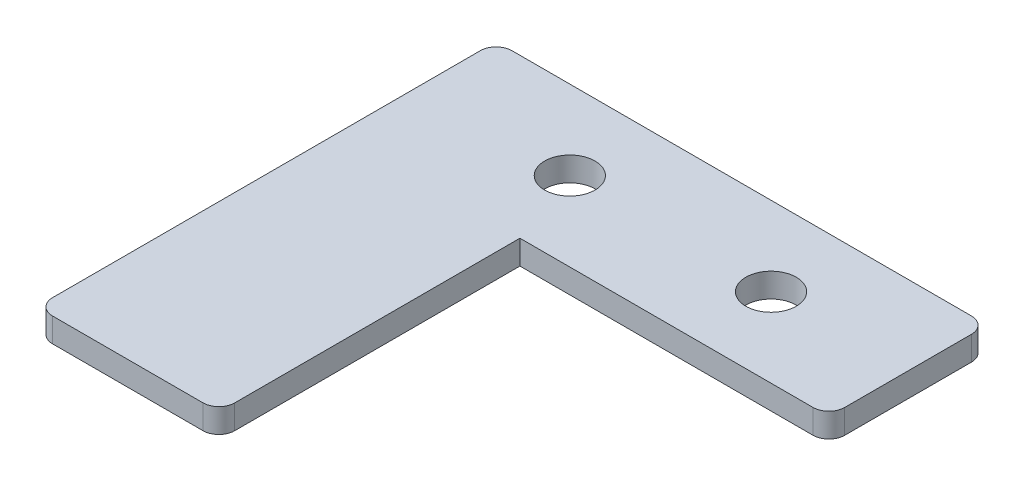
ISO-10303-21;
HEADER;
FILE_DESCRIPTION(('STEP AP214'),'2;1');
FILE_NAME('part.step','',(''),(''),'','','');
FILE_SCHEMA(('AUTOMOTIVE_DESIGN { 1 0 10303 214 1 1 1 1 }'));
ENDSEC;
DATA;
#1=APPLICATION_CONTEXT('core data for automotive mechanical design processes');
#2=APPLICATION_PROTOCOL_DEFINITION('international standard','automotive_design',2000,#1);
#3=PRODUCT_CONTEXT('',#1,'mechanical');
#4=PRODUCT('Part','Part','',(#3));
#5=PRODUCT_RELATED_PRODUCT_CATEGORY('part','',(#4));
#6=PRODUCT_DEFINITION_FORMATION('','',#4);
#7=PRODUCT_DEFINITION_CONTEXT('part definition',#1,'design');
#8=PRODUCT_DEFINITION('design','',#6,#7);
#9=PRODUCT_DEFINITION_SHAPE('','',#8);
#10=(LENGTH_UNIT() NAMED_UNIT(*) SI_UNIT(.MILLI.,.METRE.));
#11=(NAMED_UNIT(*) PLANE_ANGLE_UNIT() SI_UNIT($,.RADIAN.));
#12=(NAMED_UNIT(*) SI_UNIT($,.STERADIAN.) SOLID_ANGLE_UNIT());
#13=UNCERTAINTY_MEASURE_WITH_UNIT(LENGTH_MEASURE(1.E-05),#10,'distance_accuracy_value','');
#14=(GEOMETRIC_REPRESENTATION_CONTEXT(3) GLOBAL_UNCERTAINTY_ASSIGNED_CONTEXT((#13)) GLOBAL_UNIT_ASSIGNED_CONTEXT((#10,
#11,#12)) REPRESENTATION_CONTEXT('',''));
#15=CARTESIAN_POINT('',(0.,0.,0.));
#16=DIRECTION('',(0.,0.,1.));
#17=DIRECTION('',(1.,0.,0.));
#18=AXIS2_PLACEMENT_3D('',#15,#16,#17);
#19=CARTESIAN_POINT('',(-9.65,1.524,0.));
#20=DIRECTION('',(1.,0.,0.));
#21=DIRECTION('',(0.,0.,-1.));
#22=AXIS2_PLACEMENT_3D('',#19,#20,#21);
#23=PLANE('',#22);
#24=DIRECTION('',(0.,0.,1.));
#25=VECTOR('',#24,1.);
#26=CARTESIAN_POINT('',(-9.65,1.524,0.));
#27=LINE('',#26,#25);
#28=CARTESIAN_POINT('',(-9.65,1.524,-4.));
#29=VERTEX_POINT('',#28);
#30=CARTESIAN_POINT('',(-9.65,1.524,23.));
#31=VERTEX_POINT('',#30);
#32=EDGE_CURVE('E163',#29,#31,#27,.T.);
#33=ORIENTED_EDGE('',*,*,#32,.F.);
#34=DIRECTION('',(0.,-1.,0.));
#35=VECTOR('',#34,1.);
#36=CARTESIAN_POINT('',(-9.65,0.,-4.));
#37=LINE('',#36,#35);
#38=CARTESIAN_POINT('',(-9.65,0.,-4.));
#39=VERTEX_POINT('',#38);
#40=EDGE_CURVE('E211',#29,#39,#37,.T.);
#41=ORIENTED_EDGE('',*,*,#40,.T.);
#42=DIRECTION('',(0.,0.,1.));
#43=VECTOR('',#42,1.);
#44=CARTESIAN_POINT('',(-9.65,0.,0.));
#45=LINE('',#44,#43);
#46=CARTESIAN_POINT('',(-9.65,0.,23.));
#47=VERTEX_POINT('',#46);
#48=EDGE_CURVE('E180',#39,#47,#45,.T.);
#49=ORIENTED_EDGE('',*,*,#48,.T.);
#50=DIRECTION('',(0.,-1.,0.));
#51=VECTOR('',#50,1.);
#52=CARTESIAN_POINT('',(-9.65,1.524,23.));
#53=LINE('',#52,#51);
#54=EDGE_CURVE('E143',#47,#31,#53,.F.);
#55=ORIENTED_EDGE('',*,*,#54,.T.);
#56=EDGE_LOOP('',(#33,#41,#49,#55));
#57=FACE_BOUND('',#56,.T.);
#58=ADVANCED_FACE('F45',(#57),#23,.F.);
#59=CARTESIAN_POINT('',(0.,1.524,24.));
#60=DIRECTION('',(0.,0.,-1.));
#61=DIRECTION('',(-1.,0.,0.));
#62=AXIS2_PLACEMENT_3D('',#59,#60,#61);
#63=PLANE('',#62);
#64=DIRECTION('',(1.,0.,0.));
#65=VECTOR('',#64,1.);
#66=CARTESIAN_POINT('',(0.,0.,24.));
#67=LINE('',#66,#65);
#68=CARTESIAN_POINT('',(-8.65,0.,24.));
#69=VERTEX_POINT('',#68);
#70=CARTESIAN_POINT('',(0.850000000000002,0.,24.));
#71=VERTEX_POINT('',#70);
#72=EDGE_CURVE('E184',#69,#71,#67,.T.);
#73=ORIENTED_EDGE('',*,*,#72,.T.);
#74=DIRECTION('',(0.,-1.,0.));
#75=VECTOR('',#74,1.);
#76=CARTESIAN_POINT('',(0.850000000000002,1.524,24.));
#77=LINE('',#76,#75);
#78=CARTESIAN_POINT('',(0.850000000000002,1.524,24.));
#79=VERTEX_POINT('',#78);
#80=EDGE_CURVE('E11',#71,#79,#77,.F.);
#81=ORIENTED_EDGE('',*,*,#80,.T.);
#82=DIRECTION('',(1.,0.,0.));
#83=VECTOR('',#82,1.);
#84=CARTESIAN_POINT('',(0.,1.524,24.));
#85=LINE('',#84,#83);
#86=CARTESIAN_POINT('',(-8.65,1.524,24.));
#87=VERTEX_POINT('',#86);
#88=EDGE_CURVE('E160',#87,#79,#85,.T.);
#89=ORIENTED_EDGE('',*,*,#88,.F.);
#90=DIRECTION('',(0.,-1.,0.));
#91=VECTOR('',#90,1.);
#92=CARTESIAN_POINT('',(-8.65,1.524,24.));
#93=LINE('',#92,#91);
#94=EDGE_CURVE('E54',#87,#69,#93,.T.);
#95=ORIENTED_EDGE('',*,*,#94,.T.);
#96=EDGE_LOOP('',(#73,#81,#89,#95));
#97=FACE_BOUND('',#96,.T.);
#98=ADVANCED_FACE('F266',(#97),#63,.F.);
#99=CARTESIAN_POINT('',(1.85,1.524,0.));
#100=DIRECTION('',(1.,0.,0.));
#101=DIRECTION('',(0.,0.,-1.));
#102=AXIS2_PLACEMENT_3D('',#99,#100,#101);
#103=PLANE('',#102);
#104=DIRECTION('',(0.,0.,1.));
#105=VECTOR('',#104,1.);
#106=CARTESIAN_POINT('',(1.85,1.524,0.));
#107=LINE('',#106,#105);
#108=CARTESIAN_POINT('',(1.85,1.524,5.));
#109=VERTEX_POINT('',#108);
#110=CARTESIAN_POINT('',(1.85,1.524,23.));
#111=VERTEX_POINT('',#110);
#112=EDGE_CURVE('E135',#109,#111,#107,.T.);
#113=ORIENTED_EDGE('',*,*,#112,.T.);
#114=DIRECTION('',(0.,-1.,0.));
#115=VECTOR('',#114,1.);
#116=CARTESIAN_POINT('',(1.85,0.,23.));
#117=LINE('',#116,#115);
#118=CARTESIAN_POINT('',(1.85,0.,23.));
#119=VERTEX_POINT('',#118);
#120=EDGE_CURVE('E258',#111,#119,#117,.T.);
#121=ORIENTED_EDGE('',*,*,#120,.T.);
#122=DIRECTION('',(0.,0.,1.));
#123=VECTOR('',#122,1.);
#124=CARTESIAN_POINT('',(1.85,0.,0.));
#125=LINE('',#124,#123);
#126=CARTESIAN_POINT('',(1.85,0.,5.));
#127=VERTEX_POINT('',#126);
#128=EDGE_CURVE('E138',#127,#119,#125,.T.);
#129=ORIENTED_EDGE('',*,*,#128,.F.);
#130=DIRECTION('',(0.,-1.,0.));
#131=VECTOR('',#130,1.);
#132=CARTESIAN_POINT('',(1.85,1.524,5.));
#133=LINE('',#132,#131);
#134=EDGE_CURVE('E130',#109,#127,#133,.T.);
#135=ORIENTED_EDGE('',*,*,#134,.F.);
#136=EDGE_LOOP('',(#113,#121,#129,#135));
#137=FACE_BOUND('',#136,.T.);
#138=ADVANCED_FACE('F132',(#137),#103,.T.);
#139=CARTESIAN_POINT('',(0.,1.524,5.));
#140=DIRECTION('',(0.,0.,-1.));
#141=DIRECTION('',(-1.,0.,0.));
#142=AXIS2_PLACEMENT_3D('',#139,#140,#141);
#143=PLANE('',#142);
#144=DIRECTION('',(1.,0.,0.));
#145=VECTOR('',#144,1.);
#146=CARTESIAN_POINT('',(0.,0.,5.));
#147=LINE('',#146,#145);
#148=CARTESIAN_POINT('',(20.35,0.,5.));
#149=VERTEX_POINT('',#148);
#150=EDGE_CURVE('E190',#127,#149,#147,.T.);
#151=ORIENTED_EDGE('',*,*,#150,.T.);
#152=DIRECTION('',(0.,-1.,0.));
#153=VECTOR('',#152,1.);
#154=CARTESIAN_POINT('',(20.35,1.524,5.));
#155=LINE('',#154,#153);
#156=CARTESIAN_POINT('',(20.35,1.524,5.));
#157=VERTEX_POINT('',#156);
#158=EDGE_CURVE('E149',#149,#157,#155,.F.);
#159=ORIENTED_EDGE('',*,*,#158,.T.);
#160=DIRECTION('',(1.,0.,0.));
#161=VECTOR('',#160,1.);
#162=CARTESIAN_POINT('',(0.,1.524,5.));
#163=LINE('',#162,#161);
#164=EDGE_CURVE('E146',#109,#157,#163,.T.);
#165=ORIENTED_EDGE('',*,*,#164,.F.);
#166=ORIENTED_EDGE('',*,*,#134,.T.);
#167=EDGE_LOOP('',(#151,#159,#165,#166));
#168=FACE_BOUND('',#167,.T.);
#169=ADVANCED_FACE('F147',(#168),#143,.F.);
#170=CARTESIAN_POINT('',(21.35,1.524,0.));
#171=DIRECTION('',(1.,0.,0.));
#172=DIRECTION('',(0.,0.,-1.));
#173=AXIS2_PLACEMENT_3D('',#170,#171,#172);
#174=PLANE('',#173);
#175=DIRECTION('',(0.,0.,1.));
#176=VECTOR('',#175,1.);
#177=CARTESIAN_POINT('',(21.35,0.,0.));
#178=LINE('',#177,#176);
#179=CARTESIAN_POINT('',(21.35,0.,-4.));
#180=VERTEX_POINT('',#179);
#181=CARTESIAN_POINT('',(21.35,0.,4.));
#182=VERTEX_POINT('',#181);
#183=EDGE_CURVE('E193',#180,#182,#178,.T.);
#184=ORIENTED_EDGE('',*,*,#183,.F.);
#185=DIRECTION('',(0.,-1.,0.));
#186=VECTOR('',#185,1.);
#187=CARTESIAN_POINT('',(21.35,1.524,-4.));
#188=LINE('',#187,#186);
#189=CARTESIAN_POINT('',(21.35,1.524,-4.));
#190=VERTEX_POINT('',#189);
#191=EDGE_CURVE('E68',#180,#190,#188,.F.);
#192=ORIENTED_EDGE('',*,*,#191,.T.);
#193=DIRECTION('',(0.,0.,1.));
#194=VECTOR('',#193,1.);
#195=CARTESIAN_POINT('',(21.35,1.524,0.));
#196=LINE('',#195,#194);
#197=CARTESIAN_POINT('',(21.35,1.524,4.));
#198=VERTEX_POINT('',#197);
#199=EDGE_CURVE('E151',#190,#198,#196,.T.);
#200=ORIENTED_EDGE('',*,*,#199,.T.);
#201=DIRECTION('',(0.,-1.,0.));
#202=VECTOR('',#201,1.);
#203=CARTESIAN_POINT('',(21.35,0.,4.));
#204=LINE('',#203,#202);
#205=EDGE_CURVE('E250',#198,#182,#204,.T.);
#206=ORIENTED_EDGE('',*,*,#205,.T.);
#207=EDGE_LOOP('',(#184,#192,#200,#206));
#208=FACE_BOUND('',#207,.T.);
#209=ADVANCED_FACE('F292',(#208),#174,.T.);
#210=CARTESIAN_POINT('',(12.7,1.524,0.));
#211=DIRECTION('',(0.,-1.,0.));
#212=DIRECTION('',(0.,0.,-1.));
#213=AXIS2_PLACEMENT_3D('',#210,#211,#212);
#214=CYLINDRICAL_SURFACE('',#213,1.59);
#215=CARTESIAN_POINT('',(12.7,1.524,0.));
#216=DIRECTION('',(0.,1.,0.));
#217=DIRECTION('',(0.,0.,1.));
#218=AXIS2_PLACEMENT_3D('',#215,#216,#217);
#219=CIRCLE('',#218,1.59);
#220=CARTESIAN_POINT('',(12.7,1.524,-1.59));
#221=VERTEX_POINT('',#220);
#222=EDGE_CURVE('E173',#221,#221,#219,.T.);
#223=CARTESIAN_POINT('',(12.7,0.,0.));
#224=DIRECTION('',(0.,1.,0.));
#225=DIRECTION('',(0.,0.,1.));
#226=AXIS2_PLACEMENT_3D('',#223,#224,#225);
#227=CIRCLE('',#226,1.59);
#228=CARTESIAN_POINT('',(12.7,0.,-1.59));
#229=VERTEX_POINT('',#228);
#230=EDGE_CURVE('E201',#229,#229,#227,.T.);
#231=CARTESIAN_POINT('',(12.7,1.524,-1.59));
#232=CARTESIAN_POINT('',(12.7,1.508125,-1.59));
#233=CARTESIAN_POINT('',(12.7,1.49225,-1.59));
#234=CARTESIAN_POINT('',(12.7,1.4605,-1.59));
#235=CARTESIAN_POINT('',(12.7,1.444625,-1.59));
#236=CARTESIAN_POINT('',(12.7,1.412875,-1.59));
#237=CARTESIAN_POINT('',(12.7,1.397,-1.59));
#238=CARTESIAN_POINT('',(12.7,1.36525,-1.59));
#239=CARTESIAN_POINT('',(12.7,1.349375,-1.59));
#240=CARTESIAN_POINT('',(12.7,1.317625,-1.59));
#241=CARTESIAN_POINT('',(12.7,1.30175,-1.59));
#242=CARTESIAN_POINT('',(12.7,1.27,-1.59));
#243=CARTESIAN_POINT('',(12.7,1.254125,-1.59));
#244=CARTESIAN_POINT('',(12.7,1.222375,-1.59));
#245=CARTESIAN_POINT('',(12.7,1.2065,-1.59));
#246=CARTESIAN_POINT('',(12.7,1.17475,-1.59));
#247=CARTESIAN_POINT('',(12.7,1.158875,-1.59));
#248=CARTESIAN_POINT('',(12.7,1.127125,-1.59));
#249=CARTESIAN_POINT('',(12.7,1.11125,-1.59));
#250=CARTESIAN_POINT('',(12.7,1.0795,-1.59));
#251=CARTESIAN_POINT('',(12.7,1.063625,-1.59));
#252=CARTESIAN_POINT('',(12.7,1.031875,-1.59));
#253=CARTESIAN_POINT('',(12.7,1.016,-1.59));
#254=CARTESIAN_POINT('',(12.7,0.98425,-1.59));
#255=CARTESIAN_POINT('',(12.7,0.968375,-1.59));
#256=CARTESIAN_POINT('',(12.7,0.936625,-1.59));
#257=CARTESIAN_POINT('',(12.7,0.92075,-1.59));
#258=CARTESIAN_POINT('',(12.7,0.889,-1.59));
#259=CARTESIAN_POINT('',(12.7,0.873125,-1.59));
#260=CARTESIAN_POINT('',(12.7,0.841375,-1.59));
#261=CARTESIAN_POINT('',(12.7,0.8255,-1.59));
#262=CARTESIAN_POINT('',(12.7,0.79375,-1.59));
#263=CARTESIAN_POINT('',(12.7,0.777875,-1.59));
#264=CARTESIAN_POINT('',(12.7,0.746125,-1.59));
#265=CARTESIAN_POINT('',(12.7,0.73025,-1.59));
#266=CARTESIAN_POINT('',(12.7,0.6985,-1.59));
#267=CARTESIAN_POINT('',(12.7,0.682625,-1.59));
#268=CARTESIAN_POINT('',(12.7,0.650875,-1.59));
#269=CARTESIAN_POINT('',(12.7,0.635,-1.59));
#270=CARTESIAN_POINT('',(12.7,0.60325,-1.59));
#271=CARTESIAN_POINT('',(12.7,0.587375,-1.59));
#272=CARTESIAN_POINT('',(12.7,0.555625,-1.59));
#273=CARTESIAN_POINT('',(12.7,0.53975,-1.59));
#274=CARTESIAN_POINT('',(12.7,0.508,-1.59));
#275=CARTESIAN_POINT('',(12.7,0.492125,-1.59));
#276=CARTESIAN_POINT('',(12.7,0.460375,-1.59));
#277=CARTESIAN_POINT('',(12.7,0.4445,-1.59));
#278=CARTESIAN_POINT('',(12.7,0.41275,-1.59));
#279=CARTESIAN_POINT('',(12.7,0.396875,-1.59));
#280=CARTESIAN_POINT('',(12.7,0.365125,-1.59));
#281=CARTESIAN_POINT('',(12.7,0.34925,-1.59));
#282=CARTESIAN_POINT('',(12.7,0.3175,-1.59));
#283=CARTESIAN_POINT('',(12.7,0.301625,-1.59));
#284=CARTESIAN_POINT('',(12.7,0.269875,-1.59));
#285=CARTESIAN_POINT('',(12.7,0.254,-1.59));
#286=CARTESIAN_POINT('',(12.7,0.22225,-1.59));
#287=CARTESIAN_POINT('',(12.7,0.206375,-1.59));
#288=CARTESIAN_POINT('',(12.7,0.174625,-1.59));
#289=CARTESIAN_POINT('',(12.7,0.15875,-1.59));
#290=CARTESIAN_POINT('',(12.7,0.127,-1.59));
#291=CARTESIAN_POINT('',(12.7,0.111125,-1.59));
#292=CARTESIAN_POINT('',(12.7,0.079375,-1.59));
#293=CARTESIAN_POINT('',(12.7,0.0635,-1.59));
#294=CARTESIAN_POINT('',(12.7,0.0317499999999999,-1.59));
#295=CARTESIAN_POINT('',(12.7,0.015875,-1.59));
#296=CARTESIAN_POINT('',(12.7,0.,-1.59));
#297=B_SPLINE_CURVE_WITH_KNOTS('',3,(#231,#232,#233,#234,#235,#236,#237,#238,#239,#240,#241,
#242,#243,#244,#245,#246,#247,#248,#249,#250,#251,#252,#253,#254,#255,#256,#257,#258,#259,#260,
#261,#262,#263,#264,#265,#266,#267,#268,#269,#270,#271,#272,#273,#274,#275,#276,#277,#278,#279,
#280,#281,#282,#283,#284,#285,#286,#287,#288,#289,#290,#291,#292,#293,#294,#295,#296),
.UNSPECIFIED.,.F.,.F.,(4,2,2,2,2,2,2,2,2,2,2,2,2,2,2,2,2,2,2,2,2,2,2,2,2,2,2,2,2,2,2,2,4),(0.,
0.0476250000000001,0.0952500000000001,0.142875,0.1905,0.238125,0.28575,0.333375,0.381,0.428625,
0.47625,0.523875,0.5715,0.619125,0.66675,0.714375,0.762,0.809625,0.85725,0.904875,0.9525,
1.000125,1.04775,1.095375,1.143,1.190625,1.23825,1.285875,1.3335,1.381125,1.42875,1.476375,
1.524),.UNSPECIFIED.);
#298=EDGE_CURVE('BSEAM325',#221,#229,#297,.T.);
#299=ORIENTED_EDGE('',*,*,#222,.T.);
#300=ORIENTED_EDGE('',*,*,#230,.F.);
#301=ORIENTED_EDGE('',*,*,#298,.T.);
#302=ORIENTED_EDGE('',*,*,#298,.F.);
#303=EDGE_LOOP('',(#299,#301,#300,#302));
#304=FACE_BOUND('',#303,.T.);
#305=ADVANCED_FACE('F325',(#304),#214,.F.);
#306=CARTESIAN_POINT('',(0.,1.524,-5.));
#307=DIRECTION('',(0.,0.,-1.));
#308=DIRECTION('',(-1.,0.,0.));
#309=AXIS2_PLACEMENT_3D('',#306,#307,#308);
#310=PLANE('',#309);
#311=DIRECTION('',(1.,0.,0.));
#312=VECTOR('',#311,1.);
#313=CARTESIAN_POINT('',(0.,0.,-5.));
#314=LINE('',#313,#312);
#315=CARTESIAN_POINT('',(-8.65,0.,-5.));
#316=VERTEX_POINT('',#315);
#317=CARTESIAN_POINT('',(20.35,0.,-5.));
#318=VERTEX_POINT('',#317);
#319=EDGE_CURVE('E197',#316,#318,#314,.T.);
#320=ORIENTED_EDGE('',*,*,#319,.F.);
#321=DIRECTION('',(0.,-1.,0.));
#322=VECTOR('',#321,1.);
#323=CARTESIAN_POINT('',(-8.65,1.524,-5.));
#324=LINE('',#323,#322);
#325=CARTESIAN_POINT('',(-8.65,1.524,-5.));
#326=VERTEX_POINT('',#325);
#327=EDGE_CURVE('E234',#316,#326,#324,.F.);
#328=ORIENTED_EDGE('',*,*,#327,.T.);
#329=DIRECTION('',(1.,0.,0.));
#330=VECTOR('',#329,1.);
#331=CARTESIAN_POINT('',(0.,1.524,-5.));
#332=LINE('',#331,#330);
#333=CARTESIAN_POINT('',(20.35,1.524,-5.));
#334=VERTEX_POINT('',#333);
#335=EDGE_CURVE('E169',#326,#334,#332,.T.);
#336=ORIENTED_EDGE('',*,*,#335,.T.);
#337=DIRECTION('',(0.,-1.,0.));
#338=VECTOR('',#337,1.);
#339=CARTESIAN_POINT('',(20.35,1.524,-5.));
#340=LINE('',#339,#338);
#341=EDGE_CURVE('E230',#334,#318,#340,.T.);
#342=ORIENTED_EDGE('',*,*,#341,.T.);
#343=EDGE_LOOP('',(#320,#328,#336,#342));
#344=FACE_BOUND('',#343,.T.);
#345=ADVANCED_FACE('F285',(#344),#310,.T.);
#346=CARTESIAN_POINT('',(0.,1.524,0.));
#347=DIRECTION('',(0.,-1.,0.));
#348=DIRECTION('',(0.,0.,-1.));
#349=AXIS2_PLACEMENT_3D('',#346,#347,#348);
#350=CYLINDRICAL_SURFACE('',#349,1.59);
#351=CARTESIAN_POINT('',(0.,1.524,0.));
#352=DIRECTION('',(0.,1.,0.));
#353=DIRECTION('',(0.,0.,1.));
#354=AXIS2_PLACEMENT_3D('',#351,#352,#353);
#355=CIRCLE('',#354,1.59);
#356=CARTESIAN_POINT('',(0.,1.524,-1.59));
#357=VERTEX_POINT('',#356);
#358=EDGE_CURVE('E144',#357,#357,#355,.T.);
#359=CARTESIAN_POINT('',(0.,0.,0.));
#360=DIRECTION('',(0.,1.,0.));
#361=DIRECTION('',(0.,0.,1.));
#362=AXIS2_PLACEMENT_3D('',#359,#360,#361);
#363=CIRCLE('',#362,1.59);
#364=CARTESIAN_POINT('',(0.,0.,-1.59));
#365=VERTEX_POINT('',#364);
#366=EDGE_CURVE('E205',#365,#365,#363,.T.);
#367=CARTESIAN_POINT('',(0.,1.524,-1.59));
#368=CARTESIAN_POINT('',(0.,1.508125,-1.59));
#369=CARTESIAN_POINT('',(0.,1.49225,-1.59));
#370=CARTESIAN_POINT('',(0.,1.4605,-1.59));
#371=CARTESIAN_POINT('',(0.,1.444625,-1.59));
#372=CARTESIAN_POINT('',(0.,1.412875,-1.59));
#373=CARTESIAN_POINT('',(0.,1.397,-1.59));
#374=CARTESIAN_POINT('',(0.,1.36525,-1.59));
#375=CARTESIAN_POINT('',(0.,1.349375,-1.59));
#376=CARTESIAN_POINT('',(0.,1.317625,-1.59));
#377=CARTESIAN_POINT('',(0.,1.30175,-1.59));
#378=CARTESIAN_POINT('',(0.,1.27,-1.59));
#379=CARTESIAN_POINT('',(0.,1.254125,-1.59));
#380=CARTESIAN_POINT('',(0.,1.222375,-1.59));
#381=CARTESIAN_POINT('',(0.,1.2065,-1.59));
#382=CARTESIAN_POINT('',(0.,1.17475,-1.59));
#383=CARTESIAN_POINT('',(0.,1.158875,-1.59));
#384=CARTESIAN_POINT('',(0.,1.127125,-1.59));
#385=CARTESIAN_POINT('',(0.,1.11125,-1.59));
#386=CARTESIAN_POINT('',(0.,1.0795,-1.59));
#387=CARTESIAN_POINT('',(0.,1.063625,-1.59));
#388=CARTESIAN_POINT('',(0.,1.031875,-1.59));
#389=CARTESIAN_POINT('',(0.,1.016,-1.59));
#390=CARTESIAN_POINT('',(0.,0.98425,-1.59));
#391=CARTESIAN_POINT('',(0.,0.968375,-1.59));
#392=CARTESIAN_POINT('',(0.,0.936625,-1.59));
#393=CARTESIAN_POINT('',(0.,0.92075,-1.59));
#394=CARTESIAN_POINT('',(0.,0.889,-1.59));
#395=CARTESIAN_POINT('',(0.,0.873125,-1.59));
#396=CARTESIAN_POINT('',(0.,0.841375,-1.59));
#397=CARTESIAN_POINT('',(0.,0.8255,-1.59));
#398=CARTESIAN_POINT('',(0.,0.79375,-1.59));
#399=CARTESIAN_POINT('',(0.,0.777875,-1.59));
#400=CARTESIAN_POINT('',(0.,0.746125,-1.59));
#401=CARTESIAN_POINT('',(0.,0.73025,-1.59));
#402=CARTESIAN_POINT('',(0.,0.6985,-1.59));
#403=CARTESIAN_POINT('',(0.,0.682625,-1.59));
#404=CARTESIAN_POINT('',(0.,0.650875,-1.59));
#405=CARTESIAN_POINT('',(0.,0.635,-1.59));
#406=CARTESIAN_POINT('',(0.,0.60325,-1.59));
#407=CARTESIAN_POINT('',(0.,0.587375,-1.59));
#408=CARTESIAN_POINT('',(0.,0.555625,-1.59));
#409=CARTESIAN_POINT('',(0.,0.53975,-1.59));
#410=CARTESIAN_POINT('',(0.,0.508,-1.59));
#411=CARTESIAN_POINT('',(0.,0.492125,-1.59));
#412=CARTESIAN_POINT('',(0.,0.460375,-1.59));
#413=CARTESIAN_POINT('',(0.,0.4445,-1.59));
#414=CARTESIAN_POINT('',(0.,0.41275,-1.59));
#415=CARTESIAN_POINT('',(0.,0.396875,-1.59));
#416=CARTESIAN_POINT('',(0.,0.365125,-1.59));
#417=CARTESIAN_POINT('',(0.,0.34925,-1.59));
#418=CARTESIAN_POINT('',(0.,0.3175,-1.59));
#419=CARTESIAN_POINT('',(0.,0.301625,-1.59));
#420=CARTESIAN_POINT('',(0.,0.269875,-1.59));
#421=CARTESIAN_POINT('',(0.,0.254,-1.59));
#422=CARTESIAN_POINT('',(0.,0.22225,-1.59));
#423=CARTESIAN_POINT('',(0.,0.206375,-1.59));
#424=CARTESIAN_POINT('',(0.,0.174625,-1.59));
#425=CARTESIAN_POINT('',(0.,0.15875,-1.59));
#426=CARTESIAN_POINT('',(0.,0.127,-1.59));
#427=CARTESIAN_POINT('',(0.,0.111125,-1.59));
#428=CARTESIAN_POINT('',(0.,0.079375,-1.59));
#429=CARTESIAN_POINT('',(0.,0.0635,-1.59));
#430=CARTESIAN_POINT('',(0.,0.0317499999999999,-1.59));
#431=CARTESIAN_POINT('',(0.,0.015875,-1.59));
#432=CARTESIAN_POINT('',(0.,0.,-1.59));
#433=B_SPLINE_CURVE_WITH_KNOTS('',3,(#367,#368,#369,#370,#371,#372,#373,#374,#375,#376,#377,
#378,#379,#380,#381,#382,#383,#384,#385,#386,#387,#388,#389,#390,#391,#392,#393,#394,#395,#396,
#397,#398,#399,#400,#401,#402,#403,#404,#405,#406,#407,#408,#409,#410,#411,#412,#413,#414,#415,
#416,#417,#418,#419,#420,#421,#422,#423,#424,#425,#426,#427,#428,#429,#430,#431,#432),
.UNSPECIFIED.,.F.,.F.,(4,2,2,2,2,2,2,2,2,2,2,2,2,2,2,2,2,2,2,2,2,2,2,2,2,2,2,2,2,2,2,2,4),(0.,
0.0476250000000001,0.0952500000000001,0.142875,0.1905,0.238125,0.28575,0.333375,0.381,0.428625,
0.47625,0.523875,0.5715,0.619125,0.66675,0.714375,0.762,0.809625,0.85725,0.904875,0.9525,
1.000125,1.04775,1.095375,1.143,1.190625,1.23825,1.285875,1.3335,1.381125,1.42875,1.476375,
1.524),.UNSPECIFIED.);
#434=EDGE_CURVE('BSEAM319',#357,#365,#433,.T.);
#435=ORIENTED_EDGE('',*,*,#358,.T.);
#436=ORIENTED_EDGE('',*,*,#366,.F.);
#437=ORIENTED_EDGE('',*,*,#434,.T.);
#438=ORIENTED_EDGE('',*,*,#434,.F.);
#439=EDGE_LOOP('',(#435,#437,#436,#438));
#440=FACE_BOUND('',#439,.T.);
#441=ADVANCED_FACE('F319',(#440),#350,.F.);
#442=CARTESIAN_POINT('',(0.,1.524,0.));
#443=DIRECTION('',(0.,1.,0.));
#444=DIRECTION('',(0.,0.,1.));
#445=AXIS2_PLACEMENT_3D('',#442,#443,#444);
#446=PLANE('',#445);
#447=ORIENTED_EDGE('',*,*,#335,.F.);
#448=CARTESIAN_POINT('',(-8.65,1.524,-4.));
#449=DIRECTION('',(0.,1.,0.));
#450=DIRECTION('',(0.,0.,1.));
#451=AXIS2_PLACEMENT_3D('',#448,#449,#450);
#452=CIRCLE('',#451,1.);
#453=EDGE_CURVE('E247',#326,#29,#452,.T.);
#454=ORIENTED_EDGE('',*,*,#453,.T.);
#455=ORIENTED_EDGE('',*,*,#32,.T.);
#456=CARTESIAN_POINT('',(-8.65,1.524,23.));
#457=DIRECTION('',(0.,1.,0.));
#458=DIRECTION('',(0.,0.,1.));
#459=AXIS2_PLACEMENT_3D('',#456,#457,#458);
#460=CIRCLE('',#459,1.);
#461=EDGE_CURVE('E237',#31,#87,#460,.T.);
#462=ORIENTED_EDGE('',*,*,#461,.T.);
#463=ORIENTED_EDGE('',*,*,#88,.T.);
#464=CARTESIAN_POINT('',(0.850000000000002,1.524,23.));
#465=DIRECTION('',(0.,1.,0.));
#466=DIRECTION('',(0.,0.,1.));
#467=AXIS2_PLACEMENT_3D('',#464,#465,#466);
#468=CIRCLE('',#467,1.);
#469=EDGE_CURVE('E158',#79,#111,#468,.T.);
#470=ORIENTED_EDGE('',*,*,#469,.T.);
#471=ORIENTED_EDGE('',*,*,#112,.F.);
#472=ORIENTED_EDGE('',*,*,#164,.T.);
#473=CARTESIAN_POINT('',(20.35,1.524,4.));
#474=DIRECTION('',(0.,1.,0.));
#475=DIRECTION('',(0.,0.,1.));
#476=AXIS2_PLACEMENT_3D('',#473,#474,#475);
#477=CIRCLE('',#476,1.);
#478=EDGE_CURVE('E61',#157,#198,#477,.T.);
#479=ORIENTED_EDGE('',*,*,#478,.T.);
#480=ORIENTED_EDGE('',*,*,#199,.F.);
#481=CARTESIAN_POINT('',(20.35,1.524,-4.));
#482=DIRECTION('',(0.,1.,0.));
#483=DIRECTION('',(0.,0.,1.));
#484=AXIS2_PLACEMENT_3D('',#481,#482,#483);
#485=CIRCLE('',#484,1.);
#486=EDGE_CURVE('E244',#190,#334,#485,.T.);
#487=ORIENTED_EDGE('',*,*,#486,.T.);
#488=EDGE_LOOP('',(#447,#454,#455,#462,#463,#470,#471,#472,#479,#480,#487));
#489=FACE_BOUND('',#488,.T.);
#490=ORIENTED_EDGE('',*,*,#222,.F.);
#491=EDGE_LOOP('',(#490));
#492=FACE_BOUND('',#491,.T.);
#493=ORIENTED_EDGE('',*,*,#358,.F.);
#494=EDGE_LOOP('',(#493));
#495=FACE_BOUND('',#494,.T.);
#496=ADVANCED_FACE('F154',(#489,#492,#495),#446,.T.);
#497=CARTESIAN_POINT('',(0.,0.,0.));
#498=DIRECTION('',(0.,1.,0.));
#499=DIRECTION('',(0.,0.,1.));
#500=AXIS2_PLACEMENT_3D('',#497,#498,#499);
#501=PLANE('',#500);
#502=ORIENTED_EDGE('',*,*,#48,.F.);
#503=CARTESIAN_POINT('',(-8.65,0.,-4.));
#504=DIRECTION('',(0.,1.,0.));
#505=DIRECTION('',(0.,0.,1.));
#506=AXIS2_PLACEMENT_3D('',#503,#504,#505);
#507=CIRCLE('',#506,1.);
#508=EDGE_CURVE('E227',#39,#316,#507,.F.);
#509=ORIENTED_EDGE('',*,*,#508,.T.);
#510=ORIENTED_EDGE('',*,*,#319,.T.);
#511=CARTESIAN_POINT('',(20.35,0.,-4.));
#512=DIRECTION('',(0.,1.,0.));
#513=DIRECTION('',(0.,0.,1.));
#514=AXIS2_PLACEMENT_3D('',#511,#512,#513);
#515=CIRCLE('',#514,1.);
#516=EDGE_CURVE('E224',#318,#180,#515,.F.);
#517=ORIENTED_EDGE('',*,*,#516,.T.);
#518=ORIENTED_EDGE('',*,*,#183,.T.);
#519=CARTESIAN_POINT('',(20.35,0.,4.));
#520=DIRECTION('',(0.,1.,0.));
#521=DIRECTION('',(0.,0.,1.));
#522=AXIS2_PLACEMENT_3D('',#519,#520,#521);
#523=CIRCLE('',#522,1.);
#524=EDGE_CURVE('E221',#182,#149,#523,.F.);
#525=ORIENTED_EDGE('',*,*,#524,.T.);
#526=ORIENTED_EDGE('',*,*,#150,.F.);
#527=ORIENTED_EDGE('',*,*,#128,.T.);
#528=CARTESIAN_POINT('',(0.850000000000002,0.,23.));
#529=DIRECTION('',(0.,1.,0.));
#530=DIRECTION('',(0.,0.,1.));
#531=AXIS2_PLACEMENT_3D('',#528,#529,#530);
#532=CIRCLE('',#531,1.);
#533=EDGE_CURVE('E218',#119,#71,#532,.F.);
#534=ORIENTED_EDGE('',*,*,#533,.T.);
#535=ORIENTED_EDGE('',*,*,#72,.F.);
#536=CARTESIAN_POINT('',(-8.65,0.,23.));
#537=DIRECTION('',(0.,1.,0.));
#538=DIRECTION('',(0.,0.,1.));
#539=AXIS2_PLACEMENT_3D('',#536,#537,#538);
#540=CIRCLE('',#539,1.);
#541=EDGE_CURVE('E215',#69,#47,#540,.F.);
#542=ORIENTED_EDGE('',*,*,#541,.T.);
#543=EDGE_LOOP('',(#502,#509,#510,#517,#518,#525,#526,#527,#534,#535,#542));
#544=FACE_BOUND('',#543,.T.);
#545=ORIENTED_EDGE('',*,*,#230,.T.);
#546=EDGE_LOOP('',(#545));
#547=FACE_BOUND('',#546,.T.);
#548=ORIENTED_EDGE('',*,*,#366,.T.);
#549=EDGE_LOOP('',(#548));
#550=FACE_BOUND('',#549,.T.);
#551=ADVANCED_FACE('F272',(#544,#547,#550),#501,.F.);
#552=CARTESIAN_POINT('',(-8.65,1.524,-4.));
#553=DIRECTION('',(0.,1.,0.));
#554=DIRECTION('',(0.,0.,1.));
#555=AXIS2_PLACEMENT_3D('',#552,#553,#554);
#556=CYLINDRICAL_SURFACE('',#555,1.);
#557=ORIENTED_EDGE('',*,*,#453,.F.);
#558=ORIENTED_EDGE('',*,*,#327,.F.);
#559=ORIENTED_EDGE('',*,*,#508,.F.);
#560=ORIENTED_EDGE('',*,*,#40,.F.);
#561=EDGE_LOOP('',(#557,#558,#559,#560));
#562=FACE_BOUND('',#561,.T.);
#563=ADVANCED_FACE('F288',(#562),#556,.T.);
#564=CARTESIAN_POINT('',(20.35,1.524,-4.));
#565=DIRECTION('',(0.,-1.,0.));
#566=DIRECTION('',(0.,0.,-1.));
#567=AXIS2_PLACEMENT_3D('',#564,#565,#566);
#568=CYLINDRICAL_SURFACE('',#567,1.);
#569=ORIENTED_EDGE('',*,*,#486,.F.);
#570=ORIENTED_EDGE('',*,*,#191,.F.);
#571=ORIENTED_EDGE('',*,*,#516,.F.);
#572=ORIENTED_EDGE('',*,*,#341,.F.);
#573=EDGE_LOOP('',(#569,#570,#571,#572));
#574=FACE_BOUND('',#573,.T.);
#575=ADVANCED_FACE('F291',(#574),#568,.T.);
#576=CARTESIAN_POINT('',(20.35,1.524,4.));
#577=DIRECTION('',(0.,1.,0.));
#578=DIRECTION('',(0.,0.,1.));
#579=AXIS2_PLACEMENT_3D('',#576,#577,#578);
#580=CYLINDRICAL_SURFACE('',#579,1.);
#581=ORIENTED_EDGE('',*,*,#478,.F.);
#582=ORIENTED_EDGE('',*,*,#158,.F.);
#583=ORIENTED_EDGE('',*,*,#524,.F.);
#584=ORIENTED_EDGE('',*,*,#205,.F.);
#585=EDGE_LOOP('',(#581,#582,#583,#584));
#586=FACE_BOUND('',#585,.T.);
#587=ADVANCED_FACE('F295',(#586),#580,.T.);
#588=CARTESIAN_POINT('',(0.850000000000002,1.524,23.));
#589=DIRECTION('',(0.,1.,0.));
#590=DIRECTION('',(0.,0.,1.));
#591=AXIS2_PLACEMENT_3D('',#588,#589,#590);
#592=CYLINDRICAL_SURFACE('',#591,1.);
#593=ORIENTED_EDGE('',*,*,#469,.F.);
#594=ORIENTED_EDGE('',*,*,#80,.F.);
#595=ORIENTED_EDGE('',*,*,#533,.F.);
#596=ORIENTED_EDGE('',*,*,#120,.F.);
#597=EDGE_LOOP('',(#593,#594,#595,#596));
#598=FACE_BOUND('',#597,.T.);
#599=ADVANCED_FACE('F275',(#598),#592,.T.);
#600=CARTESIAN_POINT('',(-8.65,1.524,23.));
#601=DIRECTION('',(0.,-1.,0.));
#602=DIRECTION('',(0.,0.,-1.));
#603=AXIS2_PLACEMENT_3D('',#600,#601,#602);
#604=CYLINDRICAL_SURFACE('',#603,1.);
#605=ORIENTED_EDGE('',*,*,#461,.F.);
#606=ORIENTED_EDGE('',*,*,#54,.F.);
#607=ORIENTED_EDGE('',*,*,#541,.F.);
#608=ORIENTED_EDGE('',*,*,#94,.F.);
#609=EDGE_LOOP('',(#605,#606,#607,#608));
#610=FACE_BOUND('',#609,.T.);
#611=ADVANCED_FACE('F47',(#610),#604,.T.);
#612=CLOSED_SHELL('',(#58,#98,#138,#169,#209,#305,#345,#441,#496,#551,#563,#575,#587,#599,#611));
#613=MANIFOLD_SOLID_BREP('B2',#612);
#614=ADVANCED_BREP_SHAPE_REPRESENTATION('',(#18,#613),#14);
#615=SHAPE_DEFINITION_REPRESENTATION(#9,#614);
ENDSEC;
END-ISO-10303-21;
